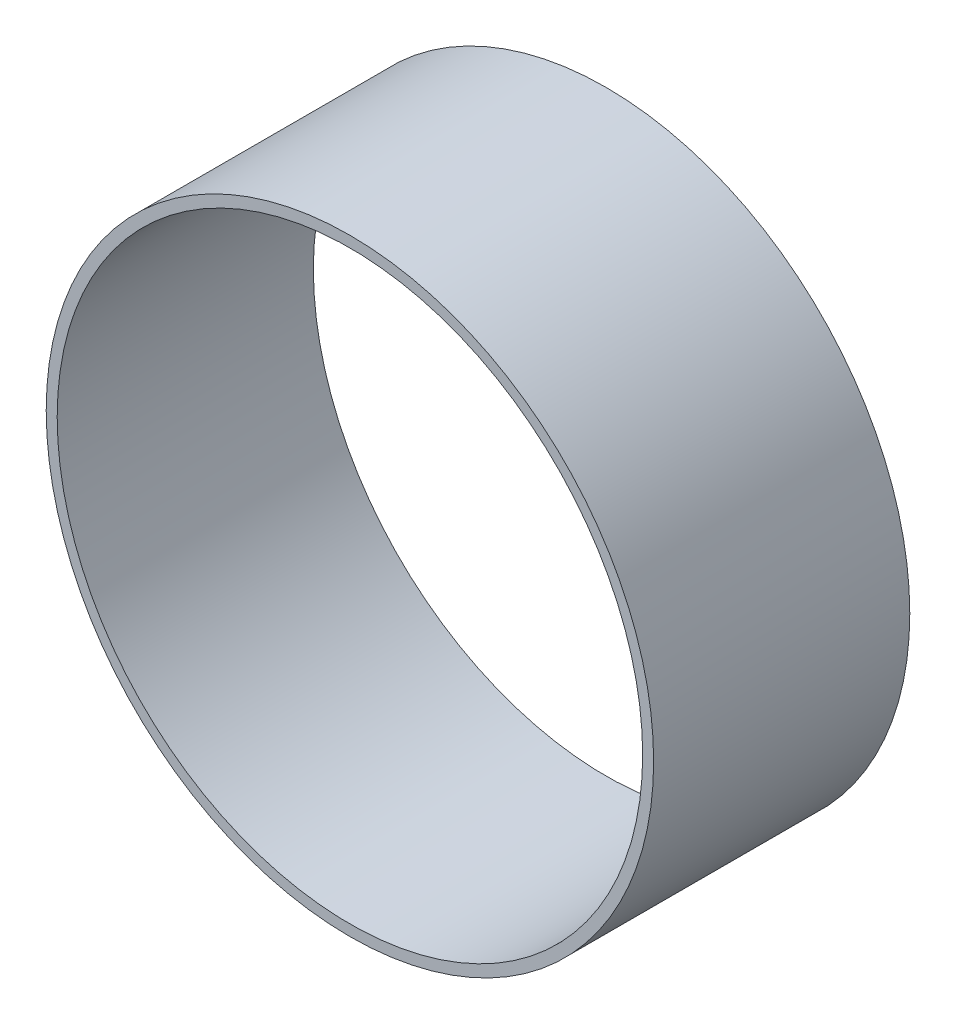
ISO-10303-21;
HEADER;
FILE_DESCRIPTION(('STEP AP214'),'2;1');
FILE_NAME('part.step','',(''),(''),'','','');
FILE_SCHEMA(('AUTOMOTIVE_DESIGN { 1 0 10303 214 1 1 1 1 }'));
ENDSEC;
DATA;
#1=APPLICATION_CONTEXT('core data for automotive mechanical design processes');
#2=APPLICATION_PROTOCOL_DEFINITION('international standard','automotive_design',2000,#1);
#3=PRODUCT_CONTEXT('',#1,'mechanical');
#4=PRODUCT('Part','Part','',(#3));
#5=PRODUCT_RELATED_PRODUCT_CATEGORY('part','',(#4));
#6=PRODUCT_DEFINITION_FORMATION('','',#4);
#7=PRODUCT_DEFINITION_CONTEXT('part definition',#1,'design');
#8=PRODUCT_DEFINITION('design','',#6,#7);
#9=PRODUCT_DEFINITION_SHAPE('','',#8);
#10=(LENGTH_UNIT() NAMED_UNIT(*) SI_UNIT(.MILLI.,.METRE.));
#11=(NAMED_UNIT(*) PLANE_ANGLE_UNIT() SI_UNIT($,.RADIAN.));
#12=(NAMED_UNIT(*) SI_UNIT($,.STERADIAN.) SOLID_ANGLE_UNIT());
#13=UNCERTAINTY_MEASURE_WITH_UNIT(LENGTH_MEASURE(1.E-05),#10,'distance_accuracy_value','');
#14=(GEOMETRIC_REPRESENTATION_CONTEXT(3) GLOBAL_UNCERTAINTY_ASSIGNED_CONTEXT((#13)) GLOBAL_UNIT_ASSIGNED_CONTEXT((#10,
#11,#12)) REPRESENTATION_CONTEXT('',''));
#15=CARTESIAN_POINT('',(0.,0.,0.));
#16=DIRECTION('',(0.,0.,1.));
#17=DIRECTION('',(1.,0.,0.));
#18=AXIS2_PLACEMENT_3D('',#15,#16,#17);
#19=CARTESIAN_POINT('',(0.,0.,35.));
#20=DIRECTION('',(0.,0.,1.));
#21=DIRECTION('',(1.,0.,0.));
#22=AXIS2_PLACEMENT_3D('',#19,#20,#21);
#23=PLANE('',#22);
#24=CARTESIAN_POINT('',(0.,0.,35.));
#25=DIRECTION('',(0.,0.,1.));
#26=DIRECTION('',(1.,0.,0.));
#27=AXIS2_PLACEMENT_3D('',#24,#25,#26);
#28=CIRCLE('',#27,83.);
#29=CARTESIAN_POINT('',(83.,0.,35.));
#30=VERTEX_POINT('',#29);
#31=EDGE_CURVE('E10',#30,#30,#28,.T.);
#32=ORIENTED_EDGE('',*,*,#31,.T.);
#33=EDGE_LOOP('',(#32));
#34=FACE_BOUND('',#33,.T.);
#35=CARTESIAN_POINT('',(0.,0.,35.));
#36=DIRECTION('',(0.,0.,1.));
#37=DIRECTION('',(1.,0.,0.));
#38=AXIS2_PLACEMENT_3D('',#35,#36,#37);
#39=CIRCLE('',#38,80.);
#40=CARTESIAN_POINT('',(80.,0.,35.));
#41=VERTEX_POINT('',#40);
#42=EDGE_CURVE('E46',#41,#41,#39,.T.);
#43=ORIENTED_EDGE('',*,*,#42,.F.);
#44=EDGE_LOOP('',(#43));
#45=FACE_BOUND('',#44,.T.);
#46=ADVANCED_FACE('F35',(#34,#45),#23,.T.);
#47=CARTESIAN_POINT('',(0.,0.,-35.));
#48=DIRECTION('',(0.,0.,1.));
#49=DIRECTION('',(1.,0.,0.));
#50=AXIS2_PLACEMENT_3D('',#47,#48,#49);
#51=PLANE('',#50);
#52=CARTESIAN_POINT('',(0.,0.,-35.));
#53=DIRECTION('',(0.,0.,1.));
#54=DIRECTION('',(1.,0.,0.));
#55=AXIS2_PLACEMENT_3D('',#52,#53,#54);
#56=CIRCLE('',#55,83.);
#57=CARTESIAN_POINT('',(83.,0.,-35.));
#58=VERTEX_POINT('',#57);
#59=EDGE_CURVE('E39',#58,#58,#56,.T.);
#60=ORIENTED_EDGE('',*,*,#59,.F.);
#61=EDGE_LOOP('',(#60));
#62=FACE_BOUND('',#61,.T.);
#63=CARTESIAN_POINT('',(0.,0.,-35.));
#64=DIRECTION('',(0.,0.,1.));
#65=DIRECTION('',(1.,0.,0.));
#66=AXIS2_PLACEMENT_3D('',#63,#64,#65);
#67=CIRCLE('',#66,80.);
#68=CARTESIAN_POINT('',(80.,0.,-35.));
#69=VERTEX_POINT('',#68);
#70=EDGE_CURVE('E48',#69,#69,#67,.T.);
#71=ORIENTED_EDGE('',*,*,#70,.T.);
#72=EDGE_LOOP('',(#71));
#73=FACE_BOUND('',#72,.T.);
#74=ADVANCED_FACE('F58',(#62,#73),#51,.F.);
#75=CARTESIAN_POINT('',(0.,0.,35.));
#76=DIRECTION('',(0.,0.,-1.));
#77=DIRECTION('',(-1.,0.,0.));
#78=AXIS2_PLACEMENT_3D('',#75,#76,#77);
#79=CYLINDRICAL_SURFACE('',#78,83.);
#80=ORIENTED_EDGE('',*,*,#31,.F.);
#81=EDGE_LOOP('',(#80));
#82=FACE_BOUND('',#81,.T.);
#83=ORIENTED_EDGE('',*,*,#59,.T.);
#84=EDGE_LOOP('',(#83));
#85=FACE_BOUND('',#84,.T.);
#86=ADVANCED_FACE('F37',(#82,#85),#79,.T.);
#87=CARTESIAN_POINT('',(0.,0.,35.));
#88=DIRECTION('',(0.,0.,-1.));
#89=DIRECTION('',(-1.,0.,0.));
#90=AXIS2_PLACEMENT_3D('',#87,#88,#89);
#91=CYLINDRICAL_SURFACE('',#90,80.);
#92=ORIENTED_EDGE('',*,*,#42,.T.);
#93=EDGE_LOOP('',(#92));
#94=FACE_BOUND('',#93,.T.);
#95=ORIENTED_EDGE('',*,*,#70,.F.);
#96=EDGE_LOOP('',(#95));
#97=FACE_BOUND('',#96,.T.);
#98=ADVANCED_FACE('F54',(#94,#97),#91,.F.);
#99=CLOSED_SHELL('',(#46,#74,#86,#98));
#100=MANIFOLD_SOLID_BREP('B2',#99);
#101=ADVANCED_BREP_SHAPE_REPRESENTATION('',(#18,#100),#14);
#102=SHAPE_DEFINITION_REPRESENTATION(#9,#101);
ENDSEC;
END-ISO-10303-21;
